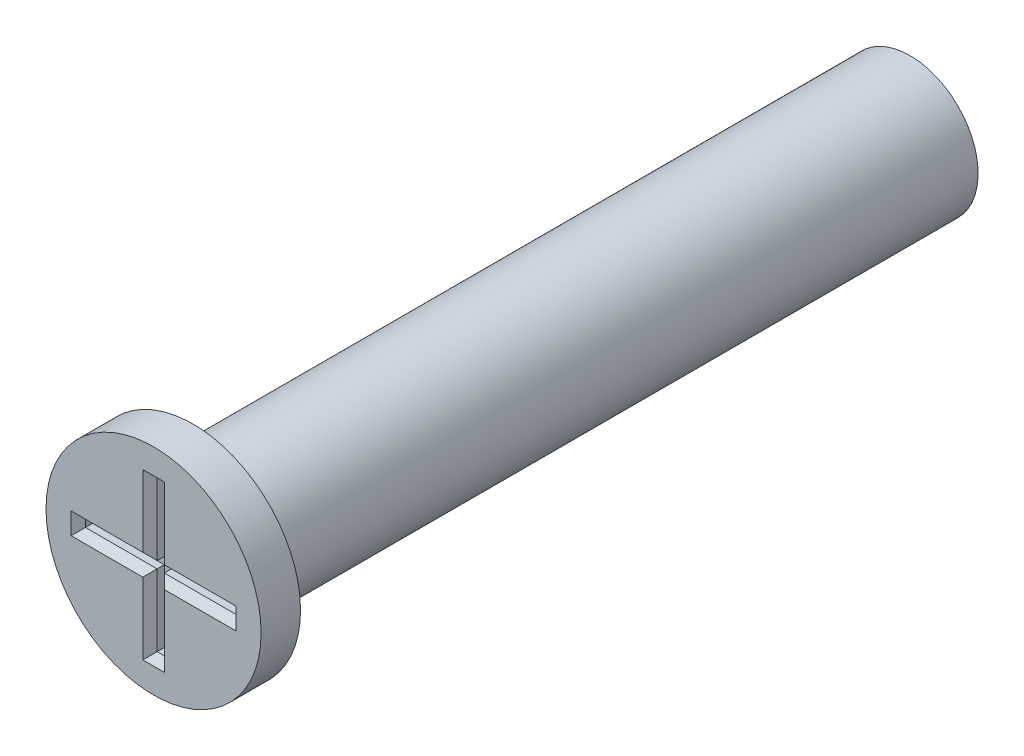
ISO-10303-21;
HEADER;
FILE_DESCRIPTION(('STEP AP214'),'2;1');
FILE_NAME('part.step','',(''),(''),'','','');
FILE_SCHEMA(('AUTOMOTIVE_DESIGN { 1 0 10303 214 1 1 1 1 }'));
ENDSEC;
DATA;
#1=APPLICATION_CONTEXT('core data for automotive mechanical design processes');
#2=APPLICATION_PROTOCOL_DEFINITION('international standard','automotive_design',2000,#1);
#3=PRODUCT_CONTEXT('',#1,'mechanical');
#4=PRODUCT('Part','Part','',(#3));
#5=PRODUCT_RELATED_PRODUCT_CATEGORY('part','',(#4));
#6=PRODUCT_DEFINITION_FORMATION('','',#4);
#7=PRODUCT_DEFINITION_CONTEXT('part definition',#1,'design');
#8=PRODUCT_DEFINITION('design','',#6,#7);
#9=PRODUCT_DEFINITION_SHAPE('','',#8);
#10=(LENGTH_UNIT() NAMED_UNIT(*) SI_UNIT(.MILLI.,.METRE.));
#11=(NAMED_UNIT(*) PLANE_ANGLE_UNIT() SI_UNIT($,.RADIAN.));
#12=(NAMED_UNIT(*) SI_UNIT($,.STERADIAN.) SOLID_ANGLE_UNIT());
#13=UNCERTAINTY_MEASURE_WITH_UNIT(LENGTH_MEASURE(1.E-05),#10,'distance_accuracy_value','');
#14=(GEOMETRIC_REPRESENTATION_CONTEXT(3) GLOBAL_UNCERTAINTY_ASSIGNED_CONTEXT((#13)) GLOBAL_UNIT_ASSIGNED_CONTEXT((#10,
#11,#12)) REPRESENTATION_CONTEXT('',''));
#15=CARTESIAN_POINT('',(0.,0.,0.));
#16=DIRECTION('',(0.,0.,1.));
#17=DIRECTION('',(1.,0.,0.));
#18=AXIS2_PLACEMENT_3D('',#15,#16,#17);
#19=CARTESIAN_POINT('',(0.,0.,10.35));
#20=DIRECTION('',(0.,0.,1.));
#21=DIRECTION('',(1.,0.,0.));
#22=AXIS2_PLACEMENT_3D('',#19,#20,#21);
#23=PLANE('',#22);
#24=DIRECTION('',(0.,-1.,0.));
#25=VECTOR('',#24,1.);
#26=CARTESIAN_POINT('',(-0.05,1.05,10.35));
#27=LINE('',#26,#25);
#28=CARTESIAN_POINT('',(-0.05,1.05,10.35));
#29=VERTEX_POINT('',#28);
#30=CARTESIAN_POINT('',(-0.05,0.0500000000000001,10.35));
#31=VERTEX_POINT('',#30);
#32=EDGE_CURVE('E140',#29,#31,#27,.T.);
#33=ORIENTED_EDGE('',*,*,#32,.T.);
#34=DIRECTION('',(-1.,0.,0.));
#35=VECTOR('',#34,1.);
#36=CARTESIAN_POINT('',(-0.05,0.0500000000000001,10.35));
#37=LINE('',#36,#35);
#38=CARTESIAN_POINT('',(-1.05,0.05,10.35));
#39=VERTEX_POINT('',#38);
#40=EDGE_CURVE('E142',#31,#39,#37,.T.);
#41=ORIENTED_EDGE('',*,*,#40,.T.);
#42=DIRECTION('',(0.,1.,0.));
#43=VECTOR('',#42,1.);
#44=CARTESIAN_POINT('',(-1.05,0.0499999999999999,10.35));
#45=LINE('',#44,#43);
#46=CARTESIAN_POINT('',(-1.05,-0.0500000000000005,10.35));
#47=VERTEX_POINT('',#46);
#48=EDGE_CURVE('E144',#39,#47,#45,.F.);
#49=ORIENTED_EDGE('',*,*,#48,.T.);
#50=DIRECTION('',(1.,0.,0.));
#51=VECTOR('',#50,1.);
#52=CARTESIAN_POINT('',(-1.05,-0.0500000000000005,10.35));
#53=LINE('',#52,#51);
#54=CARTESIAN_POINT('',(-0.0500000000000001,-0.0500000000000003,10.35));
#55=VERTEX_POINT('',#54);
#56=EDGE_CURVE('E282',#47,#55,#53,.T.);
#57=ORIENTED_EDGE('',*,*,#56,.T.);
#58=DIRECTION('',(0.,-1.,0.));
#59=VECTOR('',#58,1.);
#60=CARTESIAN_POINT('',(-0.05,-0.05,10.35));
#61=LINE('',#60,#59);
#62=CARTESIAN_POINT('',(-0.0499999999999998,-1.05,10.35));
#63=VERTEX_POINT('',#62);
#64=EDGE_CURVE('E286',#55,#63,#61,.T.);
#65=ORIENTED_EDGE('',*,*,#64,.T.);
#66=DIRECTION('',(1.,0.,0.));
#67=VECTOR('',#66,1.);
#68=CARTESIAN_POINT('',(-0.0499999999999995,-1.05,10.35));
#69=LINE('',#68,#67);
#70=CARTESIAN_POINT('',(0.0499999999999995,-1.05,10.35));
#71=VERTEX_POINT('',#70);
#72=EDGE_CURVE('E290',#63,#71,#69,.T.);
#73=ORIENTED_EDGE('',*,*,#72,.T.);
#74=DIRECTION('',(0.,1.,0.));
#75=VECTOR('',#74,1.);
#76=CARTESIAN_POINT('',(0.0499999999999995,-1.05,10.35));
#77=LINE('',#76,#75);
#78=CARTESIAN_POINT('',(0.0499999999999998,-0.0500000000000001,10.35));
#79=VERTEX_POINT('',#78);
#80=EDGE_CURVE('E294',#71,#79,#77,.T.);
#81=ORIENTED_EDGE('',*,*,#80,.T.);
#82=DIRECTION('',(1.,0.,0.));
#83=VECTOR('',#82,1.);
#84=CARTESIAN_POINT('',(0.05,-0.0500000000000001,10.35));
#85=LINE('',#84,#83);
#86=CARTESIAN_POINT('',(1.05,-0.0500000000000002,10.35));
#87=VERTEX_POINT('',#86);
#88=EDGE_CURVE('E298',#79,#87,#85,.T.);
#89=ORIENTED_EDGE('',*,*,#88,.T.);
#90=DIRECTION('',(0.,1.,0.));
#91=VECTOR('',#90,1.);
#92=CARTESIAN_POINT('',(1.05,-0.0500000000000003,10.35));
#93=LINE('',#92,#91);
#94=CARTESIAN_POINT('',(1.05,0.0499999999999997,10.35));
#95=VERTEX_POINT('',#94);
#96=EDGE_CURVE('E302',#87,#95,#93,.T.);
#97=ORIENTED_EDGE('',*,*,#96,.T.);
#98=DIRECTION('',(-1.,0.,0.));
#99=VECTOR('',#98,1.);
#100=CARTESIAN_POINT('',(1.05,0.0499999999999997,10.35));
#101=LINE('',#100,#99);
#102=CARTESIAN_POINT('',(0.0500000000000001,0.0499999999999999,10.35));
#103=VERTEX_POINT('',#102);
#104=EDGE_CURVE('E306',#95,#103,#101,.T.);
#105=ORIENTED_EDGE('',*,*,#104,.T.);
#106=DIRECTION('',(0.,1.,0.));
#107=VECTOR('',#106,1.);
#108=CARTESIAN_POINT('',(0.05,0.0500000000000003,10.35));
#109=LINE('',#108,#107);
#110=CARTESIAN_POINT('',(0.0500000000000001,1.05,10.35));
#111=VERTEX_POINT('',#110);
#112=EDGE_CURVE('E310',#103,#111,#109,.T.);
#113=ORIENTED_EDGE('',*,*,#112,.T.);
#114=DIRECTION('',(1.,0.,0.));
#115=VECTOR('',#114,1.);
#116=CARTESIAN_POINT('',(0.05,1.05,10.35));
#117=LINE('',#116,#115);
#118=EDGE_CURVE('E314',#111,#29,#117,.F.);
#119=ORIENTED_EDGE('',*,*,#118,.T.);
#120=EDGE_LOOP('',(#33,#41,#49,#57,#65,#73,#81,#89,#97,#105,#113,#119));
#121=FACE_BOUND('',#120,.T.);
#122=ADVANCED_FACE('F17',(#121),#23,.T.);
#123=CARTESIAN_POINT('',(-1.05,0.0499999999999999,10.35));
#124=DIRECTION('',(-1.,0.,0.));
#125=DIRECTION('',(0.,0.,1.));
#126=AXIS2_PLACEMENT_3D('',#123,#124,#125);
#127=PLANE('',#126);
#128=DIRECTION('',(0.,1.,0.));
#129=VECTOR('',#128,1.);
#130=CARTESIAN_POINT('',(-1.05,0.0499999999999999,10.45));
#131=LINE('',#130,#129);
#132=CARTESIAN_POINT('',(-1.05,-0.0500000000000005,10.45));
#133=VERTEX_POINT('',#132);
#134=CARTESIAN_POINT('',(-1.05,0.0499999999999999,10.45));
#135=VERTEX_POINT('',#134);
#136=EDGE_CURVE('E277',#133,#135,#131,.T.);
#137=ORIENTED_EDGE('',*,*,#136,.F.);
#138=DIRECTION('',(0.,0.,1.));
#139=VECTOR('',#138,1.);
#140=CARTESIAN_POINT('',(-1.05,-0.0500000000000005,10.35));
#141=LINE('',#140,#139);
#142=EDGE_CURVE('E155',#133,#47,#141,.F.);
#143=ORIENTED_EDGE('',*,*,#142,.T.);
#144=ORIENTED_EDGE('',*,*,#48,.F.);
#145=DIRECTION('',(0.,0.,1.));
#146=VECTOR('',#145,1.);
#147=CARTESIAN_POINT('',(-1.05,0.0499999999999999,10.35));
#148=LINE('',#147,#146);
#149=EDGE_CURVE('E149',#39,#135,#148,.T.);
#150=ORIENTED_EDGE('',*,*,#149,.T.);
#151=EDGE_LOOP('',(#137,#143,#144,#150));
#152=FACE_BOUND('',#151,.T.);
#153=ADVANCED_FACE('F152',(#152),#127,.F.);
#154=CARTESIAN_POINT('',(-0.05,0.0500000000000001,10.35));
#155=DIRECTION('',(0.,1.,0.));
#156=DIRECTION('',(-1.,0.,0.));
#157=AXIS2_PLACEMENT_3D('',#154,#155,#156);
#158=PLANE('',#157);
#159=DIRECTION('',(1.,0.,0.));
#160=VECTOR('',#159,1.);
#161=CARTESIAN_POINT('',(-0.05,0.05,10.45));
#162=LINE('',#161,#160);
#163=CARTESIAN_POINT('',(-0.05,0.0500000000000001,10.45));
#164=VERTEX_POINT('',#163);
#165=EDGE_CURVE('E161',#135,#164,#162,.T.);
#166=ORIENTED_EDGE('',*,*,#165,.F.);
#167=ORIENTED_EDGE('',*,*,#149,.F.);
#168=ORIENTED_EDGE('',*,*,#40,.F.);
#169=DIRECTION('',(0.,0.,1.));
#170=VECTOR('',#169,1.);
#171=CARTESIAN_POINT('',(-0.05,0.0500000000000001,10.35));
#172=LINE('',#171,#170);
#173=EDGE_CURVE('E164',#31,#164,#172,.T.);
#174=ORIENTED_EDGE('',*,*,#173,.T.);
#175=EDGE_LOOP('',(#166,#167,#168,#174));
#176=FACE_BOUND('',#175,.T.);
#177=ADVANCED_FACE('F159',(#176),#158,.F.);
#178=CARTESIAN_POINT('',(-0.05,1.05,10.35));
#179=DIRECTION('',(-1.,0.,0.));
#180=DIRECTION('',(0.,-1.,0.));
#181=AXIS2_PLACEMENT_3D('',#178,#179,#180);
#182=PLANE('',#181);
#183=DIRECTION('',(0.,1.,0.));
#184=VECTOR('',#183,1.);
#185=CARTESIAN_POINT('',(-0.05,1.05,10.45));
#186=LINE('',#185,#184);
#187=CARTESIAN_POINT('',(-0.05,1.05,10.45));
#188=VERTEX_POINT('',#187);
#189=EDGE_CURVE('E268',#164,#188,#186,.T.);
#190=ORIENTED_EDGE('',*,*,#189,.F.);
#191=ORIENTED_EDGE('',*,*,#173,.F.);
#192=ORIENTED_EDGE('',*,*,#32,.F.);
#193=DIRECTION('',(0.,0.,1.));
#194=VECTOR('',#193,1.);
#195=CARTESIAN_POINT('',(-0.05,1.05,10.35));
#196=LINE('',#195,#194);
#197=EDGE_CURVE('E312',#29,#188,#196,.T.);
#198=ORIENTED_EDGE('',*,*,#197,.T.);
#199=EDGE_LOOP('',(#190,#191,#192,#198));
#200=FACE_BOUND('',#199,.T.);
#201=ADVANCED_FACE('F321',(#200),#182,.F.);
#202=CARTESIAN_POINT('',(0.05,1.05,10.35));
#203=DIRECTION('',(0.,1.,0.));
#204=DIRECTION('',(0.,0.,1.));
#205=AXIS2_PLACEMENT_3D('',#202,#203,#204);
#206=PLANE('',#205);
#207=DIRECTION('',(1.,0.,0.));
#208=VECTOR('',#207,1.);
#209=CARTESIAN_POINT('',(0.05,1.05,10.45));
#210=LINE('',#209,#208);
#211=CARTESIAN_POINT('',(0.05,1.05,10.45));
#212=VERTEX_POINT('',#211);
#213=EDGE_CURVE('E262',#188,#212,#210,.T.);
#214=ORIENTED_EDGE('',*,*,#213,.F.);
#215=ORIENTED_EDGE('',*,*,#197,.F.);
#216=ORIENTED_EDGE('',*,*,#118,.F.);
#217=DIRECTION('',(0.,0.,1.));
#218=VECTOR('',#217,1.);
#219=CARTESIAN_POINT('',(0.05,1.05,10.35));
#220=LINE('',#219,#218);
#221=EDGE_CURVE('E308',#111,#212,#220,.T.);
#222=ORIENTED_EDGE('',*,*,#221,.T.);
#223=EDGE_LOOP('',(#214,#215,#216,#222));
#224=FACE_BOUND('',#223,.T.);
#225=ADVANCED_FACE('F387',(#224),#206,.F.);
#226=CARTESIAN_POINT('',(0.05,0.0500000000000003,10.35));
#227=DIRECTION('',(1.,0.,0.));
#228=DIRECTION('',(0.,1.,0.));
#229=AXIS2_PLACEMENT_3D('',#226,#227,#228);
#230=PLANE('',#229);
#231=DIRECTION('',(0.,1.,0.));
#232=VECTOR('',#231,1.);
#233=CARTESIAN_POINT('',(0.05,0.0500000000000003,10.45));
#234=LINE('',#233,#232);
#235=CARTESIAN_POINT('',(0.05,0.0500000000000002,10.45));
#236=VERTEX_POINT('',#235);
#237=EDGE_CURVE('E256',#212,#236,#234,.F.);
#238=ORIENTED_EDGE('',*,*,#237,.F.);
#239=ORIENTED_EDGE('',*,*,#221,.F.);
#240=ORIENTED_EDGE('',*,*,#112,.F.);
#241=DIRECTION('',(0.,0.,1.));
#242=VECTOR('',#241,1.);
#243=CARTESIAN_POINT('',(0.0500000000000001,0.0500000000000001,10.35));
#244=LINE('',#243,#242);
#245=EDGE_CURVE('E304',#103,#236,#244,.T.);
#246=ORIENTED_EDGE('',*,*,#245,.T.);
#247=EDGE_LOOP('',(#238,#239,#240,#246));
#248=FACE_BOUND('',#247,.T.);
#249=ADVANCED_FACE('F385',(#248),#230,.F.);
#250=CARTESIAN_POINT('',(1.05,0.0499999999999997,10.35));
#251=DIRECTION('',(0.,1.,0.));
#252=DIRECTION('',(-1.,0.,0.));
#253=AXIS2_PLACEMENT_3D('',#250,#251,#252);
#254=PLANE('',#253);
#255=DIRECTION('',(1.,0.,0.));
#256=VECTOR('',#255,1.);
#257=CARTESIAN_POINT('',(1.05,0.0499999999999999,10.45));
#258=LINE('',#257,#256);
#259=CARTESIAN_POINT('',(1.05,0.0499999999999997,10.45));
#260=VERTEX_POINT('',#259);
#261=EDGE_CURVE('E250',#236,#260,#258,.T.);
#262=ORIENTED_EDGE('',*,*,#261,.F.);
#263=ORIENTED_EDGE('',*,*,#245,.F.);
#264=ORIENTED_EDGE('',*,*,#104,.F.);
#265=DIRECTION('',(0.,0.,1.));
#266=VECTOR('',#265,1.);
#267=CARTESIAN_POINT('',(1.05,0.0499999999999997,10.35));
#268=LINE('',#267,#266);
#269=EDGE_CURVE('E300',#95,#260,#268,.T.);
#270=ORIENTED_EDGE('',*,*,#269,.T.);
#271=EDGE_LOOP('',(#262,#263,#264,#270));
#272=FACE_BOUND('',#271,.T.);
#273=ADVANCED_FACE('F378',(#272),#254,.F.);
#274=CARTESIAN_POINT('',(1.05,-0.0500000000000003,10.35));
#275=DIRECTION('',(1.,0.,0.));
#276=DIRECTION('',(0.,1.,0.));
#277=AXIS2_PLACEMENT_3D('',#274,#275,#276);
#278=PLANE('',#277);
#279=DIRECTION('',(0.,1.,0.));
#280=VECTOR('',#279,1.);
#281=CARTESIAN_POINT('',(1.05,-0.0500000000000003,10.45));
#282=LINE('',#281,#280);
#283=CARTESIAN_POINT('',(1.05,-0.0500000000000003,10.45));
#284=VERTEX_POINT('',#283);
#285=EDGE_CURVE('E244',#260,#284,#282,.F.);
#286=ORIENTED_EDGE('',*,*,#285,.F.);
#287=ORIENTED_EDGE('',*,*,#269,.F.);
#288=ORIENTED_EDGE('',*,*,#96,.F.);
#289=DIRECTION('',(0.,0.,1.));
#290=VECTOR('',#289,1.);
#291=CARTESIAN_POINT('',(1.05,-0.0500000000000002,10.35));
#292=LINE('',#291,#290);
#293=EDGE_CURVE('E296',#87,#284,#292,.T.);
#294=ORIENTED_EDGE('',*,*,#293,.T.);
#295=EDGE_LOOP('',(#286,#287,#288,#294));
#296=FACE_BOUND('',#295,.T.);
#297=ADVANCED_FACE('F366',(#296),#278,.F.);
#298=CARTESIAN_POINT('',(0.05,-0.0500000000000001,10.35));
#299=DIRECTION('',(0.,-1.,0.));
#300=DIRECTION('',(1.,0.,0.));
#301=AXIS2_PLACEMENT_3D('',#298,#299,#300);
#302=PLANE('',#301);
#303=DIRECTION('',(1.,0.,0.));
#304=VECTOR('',#303,1.);
#305=CARTESIAN_POINT('',(0.05,-0.0500000000000002,10.45));
#306=LINE('',#305,#304);
#307=CARTESIAN_POINT('',(0.05,-0.0500000000000001,10.45));
#308=VERTEX_POINT('',#307);
#309=EDGE_CURVE('E238',#284,#308,#306,.F.);
#310=ORIENTED_EDGE('',*,*,#309,.F.);
#311=ORIENTED_EDGE('',*,*,#293,.F.);
#312=ORIENTED_EDGE('',*,*,#88,.F.);
#313=DIRECTION('',(0.,0.,1.));
#314=VECTOR('',#313,1.);
#315=CARTESIAN_POINT('',(0.05,-0.0500000000000001,10.35));
#316=LINE('',#315,#314);
#317=EDGE_CURVE('E292',#79,#308,#316,.T.);
#318=ORIENTED_EDGE('',*,*,#317,.T.);
#319=EDGE_LOOP('',(#310,#311,#312,#318));
#320=FACE_BOUND('',#319,.T.);
#321=ADVANCED_FACE('F363',(#320),#302,.F.);
#322=CARTESIAN_POINT('',(0.0499999999999995,-1.05,10.35));
#323=DIRECTION('',(1.,0.,0.));
#324=DIRECTION('',(0.,1.,0.));
#325=AXIS2_PLACEMENT_3D('',#322,#323,#324);
#326=PLANE('',#325);
#327=DIRECTION('',(0.,1.,0.));
#328=VECTOR('',#327,1.);
#329=CARTESIAN_POINT('',(0.0499999999999998,-1.05,10.45));
#330=LINE('',#329,#328);
#331=CARTESIAN_POINT('',(0.0499999999999996,-1.05,10.45));
#332=VERTEX_POINT('',#331);
#333=EDGE_CURVE('E232',#308,#332,#330,.F.);
#334=ORIENTED_EDGE('',*,*,#333,.F.);
#335=ORIENTED_EDGE('',*,*,#317,.F.);
#336=ORIENTED_EDGE('',*,*,#80,.F.);
#337=DIRECTION('',(0.,0.,-1.));
#338=VECTOR('',#337,1.);
#339=CARTESIAN_POINT('',(0.0499999999999995,-1.05,10.35));
#340=LINE('',#339,#338);
#341=EDGE_CURVE('E288',#71,#332,#340,.F.);
#342=ORIENTED_EDGE('',*,*,#341,.T.);
#343=EDGE_LOOP('',(#334,#335,#336,#342));
#344=FACE_BOUND('',#343,.T.);
#345=ADVANCED_FACE('F356',(#344),#326,.F.);
#346=CARTESIAN_POINT('',(-0.0499999999999995,-1.05,10.35));
#347=DIRECTION('',(0.,-1.,0.));
#348=DIRECTION('',(0.,0.,-1.));
#349=AXIS2_PLACEMENT_3D('',#346,#347,#348);
#350=PLANE('',#349);
#351=DIRECTION('',(1.,0.,0.));
#352=VECTOR('',#351,1.);
#353=CARTESIAN_POINT('',(-0.0499999999999995,-1.05,10.45));
#354=LINE('',#353,#352);
#355=CARTESIAN_POINT('',(-0.0499999999999995,-1.05,10.45));
#356=VERTEX_POINT('',#355);
#357=EDGE_CURVE('E226',#332,#356,#354,.F.);
#358=ORIENTED_EDGE('',*,*,#357,.F.);
#359=ORIENTED_EDGE('',*,*,#341,.F.);
#360=ORIENTED_EDGE('',*,*,#72,.F.);
#361=DIRECTION('',(0.,0.,1.));
#362=VECTOR('',#361,1.);
#363=CARTESIAN_POINT('',(-0.0499999999999995,-1.05,10.35));
#364=LINE('',#363,#362);
#365=EDGE_CURVE('E284',#63,#356,#364,.T.);
#366=ORIENTED_EDGE('',*,*,#365,.T.);
#367=EDGE_LOOP('',(#358,#359,#360,#366));
#368=FACE_BOUND('',#367,.T.);
#369=ADVANCED_FACE('F345',(#368),#350,.F.);
#370=CARTESIAN_POINT('',(-0.05,-0.05,10.35));
#371=DIRECTION('',(-1.,0.,0.));
#372=DIRECTION('',(0.,-1.,0.));
#373=AXIS2_PLACEMENT_3D('',#370,#371,#372);
#374=PLANE('',#373);
#375=DIRECTION('',(0.,1.,0.));
#376=VECTOR('',#375,1.);
#377=CARTESIAN_POINT('',(-0.0499999999999997,-0.05,10.45));
#378=LINE('',#377,#376);
#379=CARTESIAN_POINT('',(-0.05,-0.0500000000000001,10.45));
#380=VERTEX_POINT('',#379);
#381=EDGE_CURVE('E221',#356,#380,#378,.T.);
#382=ORIENTED_EDGE('',*,*,#381,.F.);
#383=ORIENTED_EDGE('',*,*,#365,.F.);
#384=ORIENTED_EDGE('',*,*,#64,.F.);
#385=DIRECTION('',(0.,0.,1.));
#386=VECTOR('',#385,1.);
#387=CARTESIAN_POINT('',(-0.0500000000000001,-0.0500000000000002,10.35));
#388=LINE('',#387,#386);
#389=EDGE_CURVE('E280',#55,#380,#388,.T.);
#390=ORIENTED_EDGE('',*,*,#389,.T.);
#391=EDGE_LOOP('',(#382,#383,#384,#390));
#392=FACE_BOUND('',#391,.T.);
#393=ADVANCED_FACE('F342',(#392),#374,.F.);
#394=CARTESIAN_POINT('',(-1.05,-0.0500000000000005,10.35));
#395=DIRECTION('',(0.,-1.,0.));
#396=DIRECTION('',(1.,0.,0.));
#397=AXIS2_PLACEMENT_3D('',#394,#395,#396);
#398=PLANE('',#397);
#399=DIRECTION('',(1.,0.,0.));
#400=VECTOR('',#399,1.);
#401=CARTESIAN_POINT('',(-1.05,-0.0500000000000003,10.45));
#402=LINE('',#401,#400);
#403=EDGE_CURVE('E217',#380,#133,#402,.F.);
#404=ORIENTED_EDGE('',*,*,#403,.F.);
#405=ORIENTED_EDGE('',*,*,#389,.F.);
#406=ORIENTED_EDGE('',*,*,#56,.F.);
#407=ORIENTED_EDGE('',*,*,#142,.F.);
#408=EDGE_LOOP('',(#404,#405,#406,#407));
#409=FACE_BOUND('',#408,.T.);
#410=ADVANCED_FACE('F336',(#409),#398,.F.);
#411=CARTESIAN_POINT('',(-1.05,0.0499999999999999,10.45));
#412=DIRECTION('',(0.707106781186545,0.,0.70710678118655));
#413=DIRECTION('',(0.70710678118655,0.,-0.707106781186545));
#414=AXIS2_PLACEMENT_3D('',#411,#412,#413);
#415=PLANE('',#414);
#416=DIRECTION('',(0.57735026918962,-0.577350269189629,-0.577350269189628));
#417=VECTOR('',#416,1.);
#418=CARTESIAN_POINT('',(-1.15,0.150000000000001,10.55));
#419=LINE('',#418,#417);
#420=CARTESIAN_POINT('',(-1.15,0.15,10.55));
#421=VERTEX_POINT('',#420);
#422=EDGE_CURVE('E275',#421,#135,#419,.T.);
#423=ORIENTED_EDGE('',*,*,#422,.F.);
#424=DIRECTION('',(0.,1.,0.));
#425=VECTOR('',#424,1.);
#426=CARTESIAN_POINT('',(-1.15,0.,10.55));
#427=LINE('',#426,#425);
#428=CARTESIAN_POINT('',(-1.15,-0.15,10.55));
#429=VERTEX_POINT('',#428);
#430=EDGE_CURVE('E212',#429,#421,#427,.T.);
#431=ORIENTED_EDGE('',*,*,#430,.F.);
#432=DIRECTION('',(-0.577350269189626,-0.577350269189629,0.577350269189623));
#433=VECTOR('',#432,1.);
#434=CARTESIAN_POINT('',(-1.05,-0.0500000000000005,10.45));
#435=LINE('',#434,#433);
#436=EDGE_CURVE('E214',#133,#429,#435,.T.);
#437=ORIENTED_EDGE('',*,*,#436,.F.);
#438=ORIENTED_EDGE('',*,*,#136,.T.);
#439=EDGE_LOOP('',(#423,#431,#437,#438));
#440=FACE_BOUND('',#439,.T.);
#441=ADVANCED_FACE('F330',(#440),#415,.T.);
#442=CARTESIAN_POINT('',(-0.05,0.0500000000000001,10.45));
#443=DIRECTION('',(0.,-0.707106781186546,0.70710678118655));
#444=DIRECTION('',(0.,-0.70710678118655,-0.707106781186546));
#445=AXIS2_PLACEMENT_3D('',#442,#443,#444);
#446=PLANE('',#445);
#447=ORIENTED_EDGE('',*,*,#422,.T.);
#448=ORIENTED_EDGE('',*,*,#165,.T.);
#449=DIRECTION('',(0.577350269189629,-0.577350269189625,-0.577350269189623));
#450=VECTOR('',#449,1.);
#451=CARTESIAN_POINT('',(-0.15,0.15,10.55));
#452=LINE('',#451,#450);
#453=CARTESIAN_POINT('',(-0.15,0.15,10.55));
#454=VERTEX_POINT('',#453);
#455=EDGE_CURVE('E271',#454,#164,#452,.T.);
#456=ORIENTED_EDGE('',*,*,#455,.F.);
#457=DIRECTION('',(1.,0.,0.));
#458=VECTOR('',#457,1.);
#459=CARTESIAN_POINT('',(0.,0.15,10.55));
#460=LINE('',#459,#458);
#461=EDGE_CURVE('E209',#421,#454,#460,.T.);
#462=ORIENTED_EDGE('',*,*,#461,.F.);
#463=EDGE_LOOP('',(#447,#448,#456,#462));
#464=FACE_BOUND('',#463,.T.);
#465=ADVANCED_FACE('F318',(#464),#446,.T.);
#466=CARTESIAN_POINT('',(-0.05,1.05,10.45));
#467=DIRECTION('',(0.707106781186545,0.,0.70710678118655));
#468=DIRECTION('',(0.70710678118655,0.,-0.707106781186545));
#469=AXIS2_PLACEMENT_3D('',#466,#467,#468);
#470=PLANE('',#469);
#471=ORIENTED_EDGE('',*,*,#455,.T.);
#472=ORIENTED_EDGE('',*,*,#189,.T.);
#473=DIRECTION('',(0.577350269189626,-0.577350269189629,-0.577350269189623));
#474=VECTOR('',#473,1.);
#475=CARTESIAN_POINT('',(-0.15,1.15,10.55));
#476=LINE('',#475,#474);
#477=CARTESIAN_POINT('',(-0.15,1.15,10.55));
#478=VERTEX_POINT('',#477);
#479=EDGE_CURVE('E265',#478,#188,#476,.T.);
#480=ORIENTED_EDGE('',*,*,#479,.F.);
#481=DIRECTION('',(0.,1.,0.));
#482=VECTOR('',#481,1.);
#483=CARTESIAN_POINT('',(-0.15,0.,10.55));
#484=LINE('',#483,#482);
#485=EDGE_CURVE('E206',#454,#478,#484,.T.);
#486=ORIENTED_EDGE('',*,*,#485,.F.);
#487=EDGE_LOOP('',(#471,#472,#480,#486));
#488=FACE_BOUND('',#487,.T.);
#489=ADVANCED_FACE('F325',(#488),#470,.T.);
#490=CARTESIAN_POINT('',(0.05,1.05,10.45));
#491=DIRECTION('',(0.,-0.707106781186545,0.70710678118655));
#492=DIRECTION('',(0.,-0.70710678118655,-0.707106781186545));
#493=AXIS2_PLACEMENT_3D('',#490,#491,#492);
#494=PLANE('',#493);
#495=ORIENTED_EDGE('',*,*,#479,.T.);
#496=ORIENTED_EDGE('',*,*,#213,.T.);
#497=DIRECTION('',(-0.577350269189629,-0.577350269189625,-0.577350269189623));
#498=VECTOR('',#497,1.);
#499=CARTESIAN_POINT('',(0.15,1.15,10.55));
#500=LINE('',#499,#498);
#501=CARTESIAN_POINT('',(0.15,1.15,10.55));
#502=VERTEX_POINT('',#501);
#503=EDGE_CURVE('E259',#502,#212,#500,.T.);
#504=ORIENTED_EDGE('',*,*,#503,.F.);
#505=DIRECTION('',(1.,0.,0.));
#506=VECTOR('',#505,1.);
#507=CARTESIAN_POINT('',(0.,1.15,10.55));
#508=LINE('',#507,#506);
#509=EDGE_CURVE('E203',#478,#502,#508,.T.);
#510=ORIENTED_EDGE('',*,*,#509,.F.);
#511=EDGE_LOOP('',(#495,#496,#504,#510));
#512=FACE_BOUND('',#511,.T.);
#513=ADVANCED_FACE('F389',(#512),#494,.T.);
#514=CARTESIAN_POINT('',(0.05,0.0500000000000003,10.45));
#515=DIRECTION('',(-0.707106781186545,0.,0.70710678118655));
#516=DIRECTION('',(0.70710678118655,0.,0.707106781186545));
#517=AXIS2_PLACEMENT_3D('',#514,#515,#516);
#518=PLANE('',#517);
#519=ORIENTED_EDGE('',*,*,#503,.T.);
#520=ORIENTED_EDGE('',*,*,#237,.T.);
#521=DIRECTION('',(-0.577350269189625,-0.577350269189629,-0.577350269189623));
#522=VECTOR('',#521,1.);
#523=CARTESIAN_POINT('',(0.15,0.150000000000001,10.55));
#524=LINE('',#523,#522);
#525=CARTESIAN_POINT('',(0.150000000000001,0.15,10.55));
#526=VERTEX_POINT('',#525);
#527=EDGE_CURVE('E253',#526,#236,#524,.T.);
#528=ORIENTED_EDGE('',*,*,#527,.F.);
#529=DIRECTION('',(0.,1.,0.));
#530=VECTOR('',#529,1.);
#531=CARTESIAN_POINT('',(0.15,0.,10.55));
#532=LINE('',#531,#530);
#533=EDGE_CURVE('E200',#502,#526,#532,.F.);
#534=ORIENTED_EDGE('',*,*,#533,.F.);
#535=EDGE_LOOP('',(#519,#520,#528,#534));
#536=FACE_BOUND('',#535,.T.);
#537=ADVANCED_FACE('F392',(#536),#518,.T.);
#538=CARTESIAN_POINT('',(1.05,0.0499999999999997,10.45));
#539=DIRECTION('',(0.,-0.707106781186545,0.70710678118655));
#540=DIRECTION('',(0.,-0.70710678118655,-0.707106781186545));
#541=AXIS2_PLACEMENT_3D('',#538,#539,#540);
#542=PLANE('',#541);
#543=ORIENTED_EDGE('',*,*,#527,.T.);
#544=ORIENTED_EDGE('',*,*,#261,.T.);
#545=DIRECTION('',(-0.577350269189627,-0.577350269189623,-0.577350269189628));
#546=VECTOR('',#545,1.);
#547=CARTESIAN_POINT('',(1.15,0.15,10.55));
#548=LINE('',#547,#546);
#549=CARTESIAN_POINT('',(1.15,0.15,10.55));
#550=VERTEX_POINT('',#549);
#551=EDGE_CURVE('E247',#550,#260,#548,.T.);
#552=ORIENTED_EDGE('',*,*,#551,.F.);
#553=DIRECTION('',(1.,0.,0.));
#554=VECTOR('',#553,1.);
#555=CARTESIAN_POINT('',(0.,0.15,10.55));
#556=LINE('',#555,#554);
#557=EDGE_CURVE('E197',#526,#550,#556,.T.);
#558=ORIENTED_EDGE('',*,*,#557,.F.);
#559=EDGE_LOOP('',(#543,#544,#552,#558));
#560=FACE_BOUND('',#559,.T.);
#561=ADVANCED_FACE('F374',(#560),#542,.T.);
#562=CARTESIAN_POINT('',(1.05,-0.0500000000000003,10.45));
#563=DIRECTION('',(-0.707106781186546,0.,0.70710678118655));
#564=DIRECTION('',(0.70710678118655,0.,0.707106781186546));
#565=AXIS2_PLACEMENT_3D('',#562,#563,#564);
#566=PLANE('',#565);
#567=ORIENTED_EDGE('',*,*,#551,.T.);
#568=ORIENTED_EDGE('',*,*,#285,.T.);
#569=DIRECTION('',(-0.577350269189625,0.577350269189629,-0.577350269189623));
#570=VECTOR('',#569,1.);
#571=CARTESIAN_POINT('',(1.15,-0.150000000000001,10.55));
#572=LINE('',#571,#570);
#573=CARTESIAN_POINT('',(1.15,-0.15,10.55));
#574=VERTEX_POINT('',#573);
#575=EDGE_CURVE('E241',#574,#284,#572,.T.);
#576=ORIENTED_EDGE('',*,*,#575,.F.);
#577=DIRECTION('',(0.,1.,0.));
#578=VECTOR('',#577,1.);
#579=CARTESIAN_POINT('',(1.15,0.,10.55));
#580=LINE('',#579,#578);
#581=EDGE_CURVE('E194',#550,#574,#580,.F.);
#582=ORIENTED_EDGE('',*,*,#581,.F.);
#583=EDGE_LOOP('',(#567,#568,#576,#582));
#584=FACE_BOUND('',#583,.T.);
#585=ADVANCED_FACE('F369',(#584),#566,.T.);
#586=CARTESIAN_POINT('',(0.05,-0.0500000000000001,10.45));
#587=DIRECTION('',(0.,0.707106781186545,0.70710678118655));
#588=DIRECTION('',(0.,-0.70710678118655,0.707106781186545));
#589=AXIS2_PLACEMENT_3D('',#586,#587,#588);
#590=PLANE('',#589);
#591=ORIENTED_EDGE('',*,*,#575,.T.);
#592=ORIENTED_EDGE('',*,*,#309,.T.);
#593=DIRECTION('',(-0.577350269189629,0.577350269189625,-0.577350269189623));
#594=VECTOR('',#593,1.);
#595=CARTESIAN_POINT('',(0.15,-0.15,10.55));
#596=LINE('',#595,#594);
#597=CARTESIAN_POINT('',(0.15,-0.15,10.55));
#598=VERTEX_POINT('',#597);
#599=EDGE_CURVE('E235',#598,#308,#596,.T.);
#600=ORIENTED_EDGE('',*,*,#599,.F.);
#601=DIRECTION('',(1.,0.,0.));
#602=VECTOR('',#601,1.);
#603=CARTESIAN_POINT('',(0.,-0.15,10.55));
#604=LINE('',#603,#602);
#605=EDGE_CURVE('E191',#574,#598,#604,.F.);
#606=ORIENTED_EDGE('',*,*,#605,.F.);
#607=EDGE_LOOP('',(#591,#592,#600,#606));
#608=FACE_BOUND('',#607,.T.);
#609=ADVANCED_FACE('F433',(#608),#590,.T.);
#610=CARTESIAN_POINT('',(0.0499999999999995,-1.05,10.45));
#611=DIRECTION('',(-0.707106781186545,0.,0.70710678118655));
#612=DIRECTION('',(0.70710678118655,0.,0.707106781186545));
#613=AXIS2_PLACEMENT_3D('',#610,#611,#612);
#614=PLANE('',#613);
#615=DIRECTION('',(-0.577350269189624,0.57735026918963,-0.577350269189623));
#616=VECTOR('',#615,1.);
#617=CARTESIAN_POINT('',(0.149999999999999,-1.15,10.55));
#618=LINE('',#617,#616);
#619=CARTESIAN_POINT('',(0.15,-1.15,10.55));
#620=VERTEX_POINT('',#619);
#621=EDGE_CURVE('E229',#620,#332,#618,.T.);
#622=ORIENTED_EDGE('',*,*,#621,.F.);
#623=DIRECTION('',(0.,1.,0.));
#624=VECTOR('',#623,1.);
#625=CARTESIAN_POINT('',(0.15,0.,10.55));
#626=LINE('',#625,#624);
#627=EDGE_CURVE('E188',#598,#620,#626,.F.);
#628=ORIENTED_EDGE('',*,*,#627,.F.);
#629=ORIENTED_EDGE('',*,*,#599,.T.);
#630=ORIENTED_EDGE('',*,*,#333,.T.);
#631=EDGE_LOOP('',(#622,#628,#629,#630));
#632=FACE_BOUND('',#631,.T.);
#633=ADVANCED_FACE('F352',(#632),#614,.T.);
#634=CARTESIAN_POINT('',(-0.0499999999999995,-1.05,10.45));
#635=DIRECTION('',(0.,0.707106781186545,0.70710678118655));
#636=DIRECTION('',(0.,-0.70710678118655,0.707106781186545));
#637=AXIS2_PLACEMENT_3D('',#634,#635,#636);
#638=PLANE('',#637);
#639=DIRECTION('',(0.577350269189629,0.577350269189626,-0.577350269189623));
#640=VECTOR('',#639,1.);
#641=CARTESIAN_POINT('',(-0.15,-1.15,10.55));
#642=LINE('',#641,#640);
#643=CARTESIAN_POINT('',(-0.149999999999999,-1.15,10.55));
#644=VERTEX_POINT('',#643);
#645=EDGE_CURVE('E223',#644,#356,#642,.T.);
#646=ORIENTED_EDGE('',*,*,#645,.F.);
#647=DIRECTION('',(1.,0.,0.));
#648=VECTOR('',#647,1.);
#649=CARTESIAN_POINT('',(0.,-1.15,10.55));
#650=LINE('',#649,#648);
#651=EDGE_CURVE('E183',#620,#644,#650,.F.);
#652=ORIENTED_EDGE('',*,*,#651,.F.);
#653=ORIENTED_EDGE('',*,*,#621,.T.);
#654=ORIENTED_EDGE('',*,*,#357,.T.);
#655=EDGE_LOOP('',(#646,#652,#653,#654));
#656=FACE_BOUND('',#655,.T.);
#657=ADVANCED_FACE('F348',(#656),#638,.T.);
#658=CARTESIAN_POINT('',(-0.05,-0.05,10.45));
#659=DIRECTION('',(0.707106781186545,0.,0.70710678118655));
#660=DIRECTION('',(0.70710678118655,0.,-0.707106781186545));
#661=AXIS2_PLACEMENT_3D('',#658,#659,#660);
#662=PLANE('',#661);
#663=DIRECTION('',(0.577350269189625,0.577350269189629,-0.577350269189623));
#664=VECTOR('',#663,1.);
#665=CARTESIAN_POINT('',(-0.15,-0.150000000000001,10.55));
#666=LINE('',#665,#664);
#667=CARTESIAN_POINT('',(-0.15,-0.15,10.55));
#668=VERTEX_POINT('',#667);
#669=EDGE_CURVE('E35',#668,#380,#666,.T.);
#670=ORIENTED_EDGE('',*,*,#669,.F.);
#671=DIRECTION('',(0.,1.,0.));
#672=VECTOR('',#671,1.);
#673=CARTESIAN_POINT('',(-0.149999999999999,0.,10.55));
#674=LINE('',#673,#672);
#675=EDGE_CURVE('E178',#644,#668,#674,.T.);
#676=ORIENTED_EDGE('',*,*,#675,.F.);
#677=ORIENTED_EDGE('',*,*,#645,.T.);
#678=ORIENTED_EDGE('',*,*,#381,.T.);
#679=EDGE_LOOP('',(#670,#676,#677,#678));
#680=FACE_BOUND('',#679,.T.);
#681=ADVANCED_FACE('F426',(#680),#662,.T.);
#682=CARTESIAN_POINT('',(-1.05,-0.0500000000000005,10.45));
#683=DIRECTION('',(0.,0.707106781186545,0.70710678118655));
#684=DIRECTION('',(0.,-0.70710678118655,0.707106781186545));
#685=AXIS2_PLACEMENT_3D('',#682,#683,#684);
#686=PLANE('',#685);
#687=ORIENTED_EDGE('',*,*,#436,.T.);
#688=DIRECTION('',(1.,0.,0.));
#689=VECTOR('',#688,1.);
#690=CARTESIAN_POINT('',(0.,-0.15,10.55));
#691=LINE('',#690,#689);
#692=EDGE_CURVE('E174',#668,#429,#691,.F.);
#693=ORIENTED_EDGE('',*,*,#692,.F.);
#694=ORIENTED_EDGE('',*,*,#669,.T.);
#695=ORIENTED_EDGE('',*,*,#403,.T.);
#696=EDGE_LOOP('',(#687,#693,#694,#695));
#697=FACE_BOUND('',#696,.T.);
#698=ADVANCED_FACE('F332',(#697),#686,.T.);
#699=CARTESIAN_POINT('',(0.,0.,10.55));
#700=DIRECTION('',(0.,0.,1.));
#701=DIRECTION('',(1.,0.,0.));
#702=AXIS2_PLACEMENT_3D('',#699,#700,#701);
#703=PLANE('',#702);
#704=CARTESIAN_POINT('',(0.,0.,10.55));
#705=DIRECTION('',(0.,0.,-1.));
#706=DIRECTION('',(-1.,0.,0.));
#707=AXIS2_PLACEMENT_3D('',#704,#705,#706);
#708=CIRCLE('',#707,1.5);
#709=CARTESIAN_POINT('',(-1.5,0.,10.55));
#710=VERTEX_POINT('',#709);
#711=EDGE_CURVE('E20',#710,#710,#708,.T.);
#712=ORIENTED_EDGE('',*,*,#711,.F.);
#713=EDGE_LOOP('',(#712));
#714=FACE_BOUND('',#713,.T.);
#715=ORIENTED_EDGE('',*,*,#675,.T.);
#716=ORIENTED_EDGE('',*,*,#692,.T.);
#717=ORIENTED_EDGE('',*,*,#430,.T.);
#718=ORIENTED_EDGE('',*,*,#461,.T.);
#719=ORIENTED_EDGE('',*,*,#485,.T.);
#720=ORIENTED_EDGE('',*,*,#509,.T.);
#721=ORIENTED_EDGE('',*,*,#533,.T.);
#722=ORIENTED_EDGE('',*,*,#557,.T.);
#723=ORIENTED_EDGE('',*,*,#581,.T.);
#724=ORIENTED_EDGE('',*,*,#605,.T.);
#725=ORIENTED_EDGE('',*,*,#627,.T.);
#726=ORIENTED_EDGE('',*,*,#651,.T.);
#727=EDGE_LOOP('',(#715,#716,#717,#718,#719,#720,#721,#722,#723,#724,#725,#726));
#728=FACE_BOUND('',#727,.T.);
#729=ADVANCED_FACE('F327',(#714,#728),#703,.T.);
#730=CARTESIAN_POINT('',(0.,0.,10.55));
#731=DIRECTION('',(0.,0.,-1.));
#732=DIRECTION('',(-1.,0.,0.));
#733=AXIS2_PLACEMENT_3D('',#730,#731,#732);
#734=CYLINDRICAL_SURFACE('',#733,1.5);
#735=CARTESIAN_POINT('',(0.,0.,10.));
#736=DIRECTION('',(0.,0.,-1.));
#737=DIRECTION('',(-1.,0.,0.));
#738=AXIS2_PLACEMENT_3D('',#735,#736,#737);
#739=CIRCLE('',#738,1.5);
#740=CARTESIAN_POINT('',(-1.5,0.,10.));
#741=VERTEX_POINT('',#740);
#742=EDGE_CURVE('E169',#741,#741,#739,.F.);
#743=ORIENTED_EDGE('',*,*,#742,.T.);
#744=EDGE_LOOP('',(#743));
#745=FACE_BOUND('',#744,.T.);
#746=ORIENTED_EDGE('',*,*,#711,.T.);
#747=EDGE_LOOP('',(#746));
#748=FACE_BOUND('',#747,.T.);
#749=ADVANCED_FACE('F417',(#745,#748),#734,.T.);
#750=CARTESIAN_POINT('',(0.,0.,10.));
#751=DIRECTION('',(0.,0.,1.));
#752=DIRECTION('',(1.,0.,0.));
#753=AXIS2_PLACEMENT_3D('',#750,#751,#752);
#754=PLANE('',#753);
#755=CARTESIAN_POINT('',(0.,0.,10.));
#756=DIRECTION('',(0.,0.,-1.));
#757=DIRECTION('',(-1.,0.,0.));
#758=AXIS2_PLACEMENT_3D('',#755,#756,#757);
#759=CIRCLE('',#758,0.95);
#760=CARTESIAN_POINT('',(-0.95,0.,10.));
#761=VERTEX_POINT('',#760);
#762=EDGE_CURVE('E26',#761,#761,#759,.T.);
#763=ORIENTED_EDGE('',*,*,#762,.F.);
#764=EDGE_LOOP('',(#763));
#765=FACE_BOUND('',#764,.T.);
#766=ORIENTED_EDGE('',*,*,#742,.F.);
#767=EDGE_LOOP('',(#766));
#768=FACE_BOUND('',#767,.T.);
#769=ADVANCED_FACE('F410',(#765,#768),#754,.F.);
#770=CARTESIAN_POINT('',(0.,0.,0.));
#771=DIRECTION('',(0.,0.,1.));
#772=DIRECTION('',(1.,0.,0.));
#773=AXIS2_PLACEMENT_3D('',#770,#771,#772);
#774=PLANE('',#773);
#775=CARTESIAN_POINT('',(0.,0.,0.));
#776=DIRECTION('',(0.,0.,-1.));
#777=DIRECTION('',(-1.,0.,0.));
#778=AXIS2_PLACEMENT_3D('',#775,#776,#777);
#779=CIRCLE('',#778,0.95);
#780=CARTESIAN_POINT('',(-0.95,0.,0.));
#781=VERTEX_POINT('',#780);
#782=EDGE_CURVE('E11',#781,#781,#779,.F.);
#783=ORIENTED_EDGE('',*,*,#782,.F.);
#784=EDGE_LOOP('',(#783));
#785=FACE_BOUND('',#784,.T.);
#786=ADVANCED_FACE('F404',(#785),#774,.F.);
#787=CARTESIAN_POINT('',(0.,0.,10.));
#788=DIRECTION('',(0.,0.,-1.));
#789=DIRECTION('',(-1.,0.,0.));
#790=AXIS2_PLACEMENT_3D('',#787,#788,#789);
#791=CYLINDRICAL_SURFACE('',#790,0.95);
#792=ORIENTED_EDGE('',*,*,#782,.T.);
#793=EDGE_LOOP('',(#792));
#794=FACE_BOUND('',#793,.T.);
#795=ORIENTED_EDGE('',*,*,#762,.T.);
#796=EDGE_LOOP('',(#795));
#797=FACE_BOUND('',#796,.T.);
#798=ADVANCED_FACE('F402',(#794,#797),#791,.T.);
#799=CLOSED_SHELL('',(#122,#153,#177,#201,#225,#249,#273,#297,#321,#345,#369,#393,#410,#441,
#465,#489,#513,#537,#561,#585,#609,#633,#657,#681,#698,#729,#749,#769,#786,#798));
#800=MANIFOLD_SOLID_BREP('B1',#799);
#801=ADVANCED_BREP_SHAPE_REPRESENTATION('',(#18,#800),#14);
#802=SHAPE_DEFINITION_REPRESENTATION(#9,#801);
ENDSEC;
END-ISO-10303-21;
